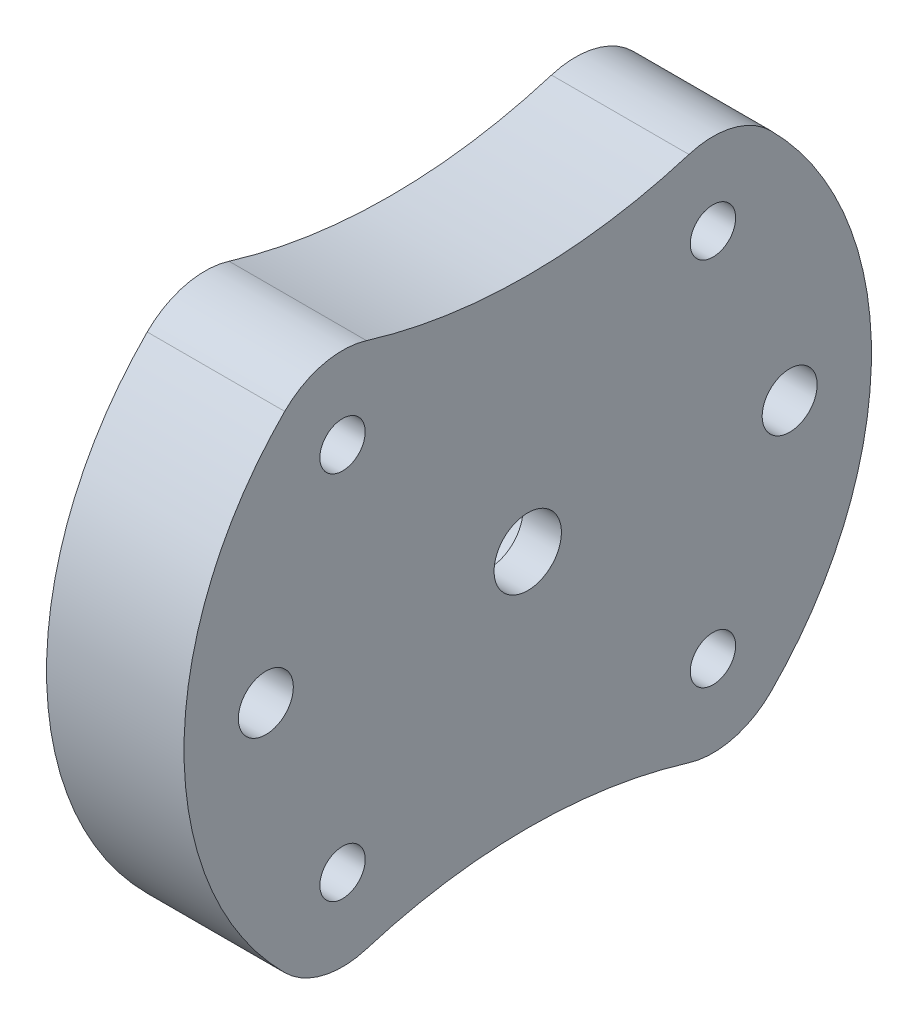
ISO-10303-21;
HEADER;
FILE_DESCRIPTION(('STEP AP214'),'2;1');
FILE_NAME('part.step','',(''),(''),'','','');
FILE_SCHEMA(('AUTOMOTIVE_DESIGN { 1 0 10303 214 1 1 1 1 }'));
ENDSEC;
DATA;
#1=APPLICATION_CONTEXT('core data for automotive mechanical design processes');
#2=APPLICATION_PROTOCOL_DEFINITION('international standard','automotive_design',2000,#1);
#3=PRODUCT_CONTEXT('',#1,'mechanical');
#4=PRODUCT('Part','Part','',(#3));
#5=PRODUCT_RELATED_PRODUCT_CATEGORY('part','',(#4));
#6=PRODUCT_DEFINITION_FORMATION('','',#4);
#7=PRODUCT_DEFINITION_CONTEXT('part definition',#1,'design');
#8=PRODUCT_DEFINITION('design','',#6,#7);
#9=PRODUCT_DEFINITION_SHAPE('','',#8);
#10=(LENGTH_UNIT() NAMED_UNIT(*) SI_UNIT(.MILLI.,.METRE.));
#11=(NAMED_UNIT(*) PLANE_ANGLE_UNIT() SI_UNIT($,.RADIAN.));
#12=(NAMED_UNIT(*) SI_UNIT($,.STERADIAN.) SOLID_ANGLE_UNIT());
#13=UNCERTAINTY_MEASURE_WITH_UNIT(LENGTH_MEASURE(1.E-05),#10,'distance_accuracy_value','');
#14=(GEOMETRIC_REPRESENTATION_CONTEXT(3) GLOBAL_UNCERTAINTY_ASSIGNED_CONTEXT((#13)) GLOBAL_UNIT_ASSIGNED_CONTEXT((#10,
#11,#12)) REPRESENTATION_CONTEXT('',''));
#15=CARTESIAN_POINT('',(0.,0.,0.));
#16=DIRECTION('',(0.,0.,1.));
#17=DIRECTION('',(1.,0.,0.));
#18=AXIS2_PLACEMENT_3D('',#15,#16,#17);
#19=CARTESIAN_POINT('',(10.,0.,0.));
#20=DIRECTION('',(-1.,0.,0.));
#21=DIRECTION('',(0.,0.,1.));
#22=AXIS2_PLACEMENT_3D('',#19,#20,#21);
#23=CYLINDRICAL_SURFACE('',#22,25.);
#24=DIRECTION('',(1.,0.,0.));
#25=VECTOR('',#24,1.);
#26=CARTESIAN_POINT('',(0.,17.6776695296637,17.6776695296637));
#27=LINE('',#26,#25);
#28=CARTESIAN_POINT('',(0.,17.6776695296637,17.6776695296637));
#29=VERTEX_POINT('',#28);
#30=CARTESIAN_POINT('',(10.,17.6776695296637,17.6776695296637));
#31=VERTEX_POINT('',#30);
#32=EDGE_CURVE('E105',#29,#31,#27,.T.);
#33=ORIENTED_EDGE('',*,*,#32,.F.);
#34=CARTESIAN_POINT('',(0.,0.,0.));
#35=DIRECTION('',(1.,0.,0.));
#36=DIRECTION('',(0.,0.,-1.));
#37=AXIS2_PLACEMENT_3D('',#34,#35,#36);
#38=CIRCLE('',#37,25.);
#39=CARTESIAN_POINT('',(0.,-17.6776695296637,17.6776695296637));
#40=VERTEX_POINT('',#39);
#41=EDGE_CURVE('E115',#29,#40,#38,.T.);
#42=ORIENTED_EDGE('',*,*,#41,.T.);
#43=DIRECTION('',(1.,0.,0.));
#44=VECTOR('',#43,1.);
#45=CARTESIAN_POINT('',(0.,-17.6776695296637,17.6776695296637));
#46=LINE('',#45,#44);
#47=CARTESIAN_POINT('',(10.,-17.6776695296637,17.6776695296637));
#48=VERTEX_POINT('',#47);
#49=EDGE_CURVE('E59',#40,#48,#46,.T.);
#50=ORIENTED_EDGE('',*,*,#49,.T.);
#51=CARTESIAN_POINT('',(10.,0.,0.));
#52=DIRECTION('',(1.,0.,0.));
#53=DIRECTION('',(0.,0.,-1.));
#54=AXIS2_PLACEMENT_3D('',#51,#52,#53);
#55=CIRCLE('',#54,25.);
#56=EDGE_CURVE('E11',#31,#48,#55,.T.);
#57=ORIENTED_EDGE('',*,*,#56,.F.);
#58=EDGE_LOOP('',(#33,#42,#50,#57));
#59=FACE_BOUND('',#58,.T.);
#60=ADVANCED_FACE('F35',(#59),#23,.T.);
#61=CARTESIAN_POINT('',(0.,-17.6776695296637,-17.6776695296637));
#62=VERTEX_POINT('',#61);
#63=CARTESIAN_POINT('',(0.,17.6776695296637,-17.6776695296637));
#64=VERTEX_POINT('',#63);
#65=EDGE_CURVE('E122',#62,#64,#38,.T.);
#66=ORIENTED_EDGE('',*,*,#65,.T.);
#67=DIRECTION('',(1.,0.,0.));
#68=VECTOR('',#67,1.);
#69=CARTESIAN_POINT('',(0.,17.6776695296637,-17.6776695296637));
#70=LINE('',#69,#68);
#71=CARTESIAN_POINT('',(10.,17.6776695296637,-17.6776695296637));
#72=VERTEX_POINT('',#71);
#73=EDGE_CURVE('E158',#64,#72,#70,.T.);
#74=ORIENTED_EDGE('',*,*,#73,.T.);
#75=CARTESIAN_POINT('',(10.,-17.6776695296637,-17.6776695296637));
#76=VERTEX_POINT('',#75);
#77=EDGE_CURVE('E43',#76,#72,#55,.T.);
#78=ORIENTED_EDGE('',*,*,#77,.F.);
#79=DIRECTION('',(1.,0.,0.));
#80=VECTOR('',#79,1.);
#81=CARTESIAN_POINT('',(0.,-17.6776695296637,-17.6776695296637));
#82=LINE('',#81,#80);
#83=EDGE_CURVE('E176',#62,#76,#82,.T.);
#84=ORIENTED_EDGE('',*,*,#83,.F.);
#85=EDGE_LOOP('',(#66,#74,#78,#84));
#86=FACE_BOUND('',#85,.T.);
#87=ADVANCED_FACE('F212',(#86),#23,.T.);
#88=CARTESIAN_POINT('',(10.,0.,0.));
#89=DIRECTION('',(1.,0.,0.));
#90=DIRECTION('',(0.,0.,-1.));
#91=AXIS2_PLACEMENT_3D('',#88,#89,#90);
#92=PLANE('',#91);
#93=CARTESIAN_POINT('',(10.,13.4703841816037,13.4703841816037));
#94=DIRECTION('',(1.,0.,0.));
#95=DIRECTION('',(0.,0.,-1.));
#96=AXIS2_PLACEMENT_3D('',#93,#94,#95);
#97=CIRCLE('',#96,1.65000000000009);
#98=CARTESIAN_POINT('',(10.,13.4703841816037,11.8203841816036));
#99=VERTEX_POINT('',#98);
#100=EDGE_CURVE('E154',#99,#99,#97,.T.);
#101=ORIENTED_EDGE('',*,*,#100,.F.);
#102=EDGE_LOOP('',(#101));
#103=FACE_BOUND('',#102,.T.);
#104=CARTESIAN_POINT('',(10.,-13.4703841816037,13.4703841816037));
#105=DIRECTION('',(1.,0.,0.));
#106=DIRECTION('',(0.,0.,-1.));
#107=AXIS2_PLACEMENT_3D('',#104,#105,#106);
#108=CIRCLE('',#107,1.65000000000006);
#109=CARTESIAN_POINT('',(10.,-13.4703841816037,11.8203841816037));
#110=VERTEX_POINT('',#109);
#111=EDGE_CURVE('E161',#110,#110,#108,.T.);
#112=ORIENTED_EDGE('',*,*,#111,.F.);
#113=EDGE_LOOP('',(#112));
#114=FACE_BOUND('',#113,.T.);
#115=CARTESIAN_POINT('',(10.,-13.4703841816037,-13.4703841816037));
#116=DIRECTION('',(1.,0.,0.));
#117=DIRECTION('',(0.,0.,-1.));
#118=AXIS2_PLACEMENT_3D('',#115,#116,#117);
#119=CIRCLE('',#118,1.65000000000003);
#120=CARTESIAN_POINT('',(10.,-13.4703841816037,-15.1203841816038));
#121=VERTEX_POINT('',#120);
#122=EDGE_CURVE('E167',#121,#121,#119,.T.);
#123=ORIENTED_EDGE('',*,*,#122,.F.);
#124=EDGE_LOOP('',(#123));
#125=FACE_BOUND('',#124,.T.);
#126=CARTESIAN_POINT('',(10.,13.4703841816037,-13.4703841816037));
#127=DIRECTION('',(1.,0.,0.));
#128=DIRECTION('',(0.,0.,-1.));
#129=AXIS2_PLACEMENT_3D('',#126,#127,#128);
#130=CIRCLE('',#129,1.65);
#131=CARTESIAN_POINT('',(10.,13.4703841816037,-15.1203841816037));
#132=VERTEX_POINT('',#131);
#133=EDGE_CURVE('E148',#132,#132,#130,.T.);
#134=ORIENTED_EDGE('',*,*,#133,.F.);
#135=EDGE_LOOP('',(#134));
#136=FACE_BOUND('',#135,.T.);
#137=CARTESIAN_POINT('',(10.,0.,19.05));
#138=DIRECTION('',(1.,0.,0.));
#139=DIRECTION('',(0.,0.,-1.));
#140=AXIS2_PLACEMENT_3D('',#137,#138,#139);
#141=CIRCLE('',#140,2.);
#142=CARTESIAN_POINT('',(10.,0.,17.05));
#143=VERTEX_POINT('',#142);
#144=EDGE_CURVE('E143',#143,#143,#141,.T.);
#145=ORIENTED_EDGE('',*,*,#144,.F.);
#146=EDGE_LOOP('',(#145));
#147=FACE_BOUND('',#146,.T.);
#148=CARTESIAN_POINT('',(10.,0.,-19.05));
#149=DIRECTION('',(1.,0.,0.));
#150=DIRECTION('',(0.,0.,1.));
#151=AXIS2_PLACEMENT_3D('',#148,#149,#150);
#152=CIRCLE('',#151,2.);
#153=CARTESIAN_POINT('',(10.,0.,-17.05));
#154=VERTEX_POINT('',#153);
#155=EDGE_CURVE('E136',#154,#154,#152,.T.);
#156=ORIENTED_EDGE('',*,*,#155,.F.);
#157=EDGE_LOOP('',(#156));
#158=FACE_BOUND('',#157,.T.);
#159=CARTESIAN_POINT('',(10.,0.,0.));
#160=DIRECTION('',(1.,0.,0.));
#161=DIRECTION('',(0.,0.,-1.));
#162=AXIS2_PLACEMENT_3D('',#159,#160,#161);
#163=CIRCLE('',#162,2.45);
#164=CARTESIAN_POINT('',(10.,0.,-2.45));
#165=VERTEX_POINT('',#164);
#166=EDGE_CURVE('E125',#165,#165,#163,.T.);
#167=ORIENTED_EDGE('',*,*,#166,.F.);
#168=EDGE_LOOP('',(#167));
#169=FACE_BOUND('',#168,.T.);
#170=ORIENTED_EDGE('',*,*,#77,.T.);
#171=CARTESIAN_POINT('',(10.,13.4703841816037,-13.4703841816037));
#172=DIRECTION('',(1.,0.,0.));
#173=DIRECTION('',(0.,0.,-1.));
#174=AXIS2_PLACEMENT_3D('',#171,#172,#173);
#175=CIRCLE('',#174,5.95);
#176=CARTESIAN_POINT('',(10.,19.1589739981217,-11.7261233354548));
#177=VERTEX_POINT('',#176);
#178=EDGE_CURVE('E110',#72,#177,#175,.T.);
#179=ORIENTED_EDGE('',*,*,#178,.T.);
#180=CARTESIAN_POINT('',(10.,57.4015946133685,0.));
#181=DIRECTION('',(1.,0.,0.));
#182=DIRECTION('',(0.,0.,-1.));
#183=AXIS2_PLACEMENT_3D('',#180,#181,#182);
#184=CIRCLE('',#183,40.);
#185=CARTESIAN_POINT('',(10.,19.1589739981217,11.7261233354548));
#186=VERTEX_POINT('',#185);
#187=EDGE_CURVE('E202',#186,#177,#184,.T.);
#188=ORIENTED_EDGE('',*,*,#187,.F.);
#189=CARTESIAN_POINT('',(10.,13.4703841816037,13.4703841816037));
#190=DIRECTION('',(1.,0.,0.));
#191=DIRECTION('',(0.,0.,-1.));
#192=AXIS2_PLACEMENT_3D('',#189,#190,#191);
#193=CIRCLE('',#192,5.95);
#194=EDGE_CURVE('E181',#186,#31,#193,.T.);
#195=ORIENTED_EDGE('',*,*,#194,.T.);
#196=ORIENTED_EDGE('',*,*,#56,.T.);
#197=CARTESIAN_POINT('',(10.,-13.4703841816037,13.4703841816037));
#198=DIRECTION('',(1.,0.,0.));
#199=DIRECTION('',(0.,0.,-1.));
#200=AXIS2_PLACEMENT_3D('',#197,#198,#199);
#201=CIRCLE('',#200,5.95);
#202=CARTESIAN_POINT('',(10.,-19.1589739981217,11.7261233354548));
#203=VERTEX_POINT('',#202);
#204=EDGE_CURVE('E186',#48,#203,#201,.T.);
#205=ORIENTED_EDGE('',*,*,#204,.T.);
#206=CARTESIAN_POINT('',(10.,-57.4015946133685,0.));
#207=DIRECTION('',(1.,0.,0.));
#208=DIRECTION('',(0.,0.,-1.));
#209=AXIS2_PLACEMENT_3D('',#206,#207,#208);
#210=CIRCLE('',#209,40.);
#211=CARTESIAN_POINT('',(10.,-19.1589739981217,-11.7261233354548));
#212=VERTEX_POINT('',#211);
#213=EDGE_CURVE('E189',#203,#212,#210,.F.);
#214=ORIENTED_EDGE('',*,*,#213,.T.);
#215=CARTESIAN_POINT('',(10.,-13.4703841816037,-13.4703841816037));
#216=DIRECTION('',(1.,0.,0.));
#217=DIRECTION('',(0.,0.,-1.));
#218=AXIS2_PLACEMENT_3D('',#215,#216,#217);
#219=CIRCLE('',#218,5.95000000000001);
#220=EDGE_CURVE('E182',#212,#76,#219,.T.);
#221=ORIENTED_EDGE('',*,*,#220,.T.);
#222=EDGE_LOOP('',(#170,#179,#188,#195,#196,#205,#214,#221));
#223=FACE_BOUND('',#222,.T.);
#224=ADVANCED_FACE('F218',(#103,#114,#125,#136,#147,#158,#169,#223),#92,.T.);
#225=CARTESIAN_POINT('',(0.,0.,0.));
#226=DIRECTION('',(1.,0.,0.));
#227=DIRECTION('',(0.,0.,-1.));
#228=AXIS2_PLACEMENT_3D('',#225,#226,#227);
#229=PLANE('',#228);
#230=CARTESIAN_POINT('',(0.,13.4703841816037,13.4703841816037));
#231=DIRECTION('',(1.,0.,0.));
#232=DIRECTION('',(0.,0.,-1.));
#233=AXIS2_PLACEMENT_3D('',#230,#231,#232);
#234=CIRCLE('',#233,1.65000000000009);
#235=CARTESIAN_POINT('',(0.,13.4703841816037,11.8203841816036));
#236=VERTEX_POINT('',#235);
#237=EDGE_CURVE('E157',#236,#236,#234,.T.);
#238=ORIENTED_EDGE('',*,*,#237,.T.);
#239=EDGE_LOOP('',(#238));
#240=FACE_BOUND('',#239,.T.);
#241=CARTESIAN_POINT('',(0.,-13.4703841816037,13.4703841816037));
#242=DIRECTION('',(1.,0.,0.));
#243=DIRECTION('',(0.,0.,-1.));
#244=AXIS2_PLACEMENT_3D('',#241,#242,#243);
#245=CIRCLE('',#244,1.65000000000006);
#246=CARTESIAN_POINT('',(0.,-13.4703841816037,11.8203841816037));
#247=VERTEX_POINT('',#246);
#248=EDGE_CURVE('E164',#247,#247,#245,.T.);
#249=ORIENTED_EDGE('',*,*,#248,.T.);
#250=EDGE_LOOP('',(#249));
#251=FACE_BOUND('',#250,.T.);
#252=CARTESIAN_POINT('',(0.,-13.4703841816037,-13.4703841816037));
#253=DIRECTION('',(1.,0.,0.));
#254=DIRECTION('',(0.,0.,-1.));
#255=AXIS2_PLACEMENT_3D('',#252,#253,#254);
#256=CIRCLE('',#255,1.65000000000003);
#257=CARTESIAN_POINT('',(0.,-13.4703841816037,-15.1203841816038));
#258=VERTEX_POINT('',#257);
#259=EDGE_CURVE('E151',#258,#258,#256,.T.);
#260=ORIENTED_EDGE('',*,*,#259,.T.);
#261=EDGE_LOOP('',(#260));
#262=FACE_BOUND('',#261,.T.);
#263=CARTESIAN_POINT('',(0.,13.4703841816037,-13.4703841816037));
#264=DIRECTION('',(1.,0.,0.));
#265=DIRECTION('',(0.,0.,-1.));
#266=AXIS2_PLACEMENT_3D('',#263,#264,#265);
#267=CIRCLE('',#266,1.65);
#268=CARTESIAN_POINT('',(0.,13.4703841816037,-15.1203841816037));
#269=VERTEX_POINT('',#268);
#270=EDGE_CURVE('E140',#269,#269,#267,.T.);
#271=ORIENTED_EDGE('',*,*,#270,.T.);
#272=EDGE_LOOP('',(#271));
#273=FACE_BOUND('',#272,.T.);
#274=CARTESIAN_POINT('',(0.,0.,19.05));
#275=DIRECTION('',(1.,0.,0.));
#276=DIRECTION('',(0.,0.,-1.));
#277=AXIS2_PLACEMENT_3D('',#274,#275,#276);
#278=CIRCLE('',#277,2.);
#279=CARTESIAN_POINT('',(0.,0.,17.05));
#280=VERTEX_POINT('',#279);
#281=EDGE_CURVE('E133',#280,#280,#278,.T.);
#282=ORIENTED_EDGE('',*,*,#281,.T.);
#283=EDGE_LOOP('',(#282));
#284=FACE_BOUND('',#283,.T.);
#285=CARTESIAN_POINT('',(0.,0.,-19.05));
#286=DIRECTION('',(1.,0.,0.));
#287=DIRECTION('',(0.,0.,1.));
#288=AXIS2_PLACEMENT_3D('',#285,#286,#287);
#289=CIRCLE('',#288,2.);
#290=CARTESIAN_POINT('',(0.,0.,-17.05));
#291=VERTEX_POINT('',#290);
#292=EDGE_CURVE('E139',#291,#291,#289,.T.);
#293=ORIENTED_EDGE('',*,*,#292,.T.);
#294=EDGE_LOOP('',(#293));
#295=FACE_BOUND('',#294,.T.);
#296=CARTESIAN_POINT('',(0.,0.,0.));
#297=DIRECTION('',(-1.,0.,0.));
#298=DIRECTION('',(0.,0.,1.));
#299=AXIS2_PLACEMENT_3D('',#296,#297,#298);
#300=CIRCLE('',#299,4.95);
#301=CARTESIAN_POINT('',(0.,0.,4.95));
#302=VERTEX_POINT('',#301);
#303=EDGE_CURVE('E129',#302,#302,#300,.T.);
#304=ORIENTED_EDGE('',*,*,#303,.F.);
#305=EDGE_LOOP('',(#304));
#306=FACE_BOUND('',#305,.T.);
#307=CARTESIAN_POINT('',(0.,13.4703841816037,-13.4703841816037));
#308=DIRECTION('',(1.,0.,0.));
#309=DIRECTION('',(0.,0.,-1.));
#310=AXIS2_PLACEMENT_3D('',#307,#308,#309);
#311=CIRCLE('',#310,5.95);
#312=CARTESIAN_POINT('',(0.,19.1589739981217,-11.7261233354548));
#313=VERTEX_POINT('',#312);
#314=EDGE_CURVE('E116',#64,#313,#311,.T.);
#315=ORIENTED_EDGE('',*,*,#314,.F.);
#316=ORIENTED_EDGE('',*,*,#65,.F.);
#317=CARTESIAN_POINT('',(0.,-13.4703841816037,-13.4703841816037));
#318=DIRECTION('',(1.,0.,0.));
#319=DIRECTION('',(0.,0.,-1.));
#320=AXIS2_PLACEMENT_3D('',#317,#318,#319);
#321=CIRCLE('',#320,5.95000000000001);
#322=CARTESIAN_POINT('',(0.,-19.1589739981217,-11.7261233354548));
#323=VERTEX_POINT('',#322);
#324=EDGE_CURVE('E174',#323,#62,#321,.T.);
#325=ORIENTED_EDGE('',*,*,#324,.F.);
#326=CARTESIAN_POINT('',(0.,-57.4015946133685,0.));
#327=DIRECTION('',(1.,0.,0.));
#328=DIRECTION('',(0.,0.,-1.));
#329=AXIS2_PLACEMENT_3D('',#326,#327,#328);
#330=CIRCLE('',#329,40.);
#331=CARTESIAN_POINT('',(0.,-19.1589739981217,11.7261233354548));
#332=VERTEX_POINT('',#331);
#333=EDGE_CURVE('E185',#332,#323,#330,.F.);
#334=ORIENTED_EDGE('',*,*,#333,.F.);
#335=CARTESIAN_POINT('',(0.,-13.4703841816037,13.4703841816037));
#336=DIRECTION('',(1.,0.,0.));
#337=DIRECTION('',(0.,0.,-1.));
#338=AXIS2_PLACEMENT_3D('',#335,#336,#337);
#339=CIRCLE('',#338,5.95);
#340=EDGE_CURVE('E121',#40,#332,#339,.T.);
#341=ORIENTED_EDGE('',*,*,#340,.F.);
#342=ORIENTED_EDGE('',*,*,#41,.F.);
#343=CARTESIAN_POINT('',(0.,13.4703841816037,13.4703841816037));
#344=DIRECTION('',(1.,0.,0.));
#345=DIRECTION('',(0.,0.,-1.));
#346=AXIS2_PLACEMENT_3D('',#343,#344,#345);
#347=CIRCLE('',#346,5.95);
#348=CARTESIAN_POINT('',(0.,19.1589739981217,11.7261233354548));
#349=VERTEX_POINT('',#348);
#350=EDGE_CURVE('E101',#349,#29,#347,.T.);
#351=ORIENTED_EDGE('',*,*,#350,.F.);
#352=CARTESIAN_POINT('',(0.,57.4015946133685,0.));
#353=DIRECTION('',(1.,0.,0.));
#354=DIRECTION('',(0.,0.,-1.));
#355=AXIS2_PLACEMENT_3D('',#352,#353,#354);
#356=CIRCLE('',#355,40.);
#357=EDGE_CURVE('E51',#349,#313,#356,.T.);
#358=ORIENTED_EDGE('',*,*,#357,.T.);
#359=EDGE_LOOP('',(#315,#316,#325,#334,#341,#342,#351,#358));
#360=FACE_BOUND('',#359,.T.);
#361=ADVANCED_FACE('F119',(#240,#251,#262,#273,#284,#295,#306,#360),#229,.F.);
#362=CARTESIAN_POINT('',(0.,0.,0.));
#363=DIRECTION('',(1.,0.,0.));
#364=DIRECTION('',(0.,0.,-1.));
#365=AXIS2_PLACEMENT_3D('',#362,#363,#364);
#366=CYLINDRICAL_SURFACE('',#365,2.45);
#367=ORIENTED_EDGE('',*,*,#166,.T.);
#368=EDGE_LOOP('',(#367));
#369=FACE_BOUND('',#368,.T.);
#370=CARTESIAN_POINT('',(7.2,0.,0.));
#371=DIRECTION('',(-1.,0.,0.));
#372=DIRECTION('',(0.,0.,1.));
#373=AXIS2_PLACEMENT_3D('',#370,#371,#372);
#374=CIRCLE('',#373,2.45);
#375=CARTESIAN_POINT('',(7.2,0.,2.45));
#376=VERTEX_POINT('',#375);
#377=EDGE_CURVE('E38',#376,#376,#374,.F.);
#378=ORIENTED_EDGE('',*,*,#377,.F.);
#379=EDGE_LOOP('',(#378));
#380=FACE_BOUND('',#379,.T.);
#381=ADVANCED_FACE('F247',(#369,#380),#366,.F.);
#382=CARTESIAN_POINT('',(7.2,0.,0.));
#383=DIRECTION('',(-1.,0.,0.));
#384=DIRECTION('',(0.,0.,1.));
#385=AXIS2_PLACEMENT_3D('',#382,#383,#384);
#386=PLANE('',#385);
#387=CARTESIAN_POINT('',(7.2,0.,0.));
#388=DIRECTION('',(-1.,0.,0.));
#389=DIRECTION('',(0.,0.,1.));
#390=AXIS2_PLACEMENT_3D('',#387,#388,#389);
#391=CIRCLE('',#390,4.95);
#392=CARTESIAN_POINT('',(7.2,0.,4.95));
#393=VERTEX_POINT('',#392);
#394=EDGE_CURVE('E132',#393,#393,#391,.T.);
#395=ORIENTED_EDGE('',*,*,#394,.T.);
#396=EDGE_LOOP('',(#395));
#397=FACE_BOUND('',#396,.T.);
#398=ORIENTED_EDGE('',*,*,#377,.T.);
#399=EDGE_LOOP('',(#398));
#400=FACE_BOUND('',#399,.T.);
#401=ADVANCED_FACE('F254',(#397,#400),#386,.T.);
#402=CARTESIAN_POINT('',(7.2,0.,0.));
#403=DIRECTION('',(-1.,0.,0.));
#404=DIRECTION('',(0.,0.,1.));
#405=AXIS2_PLACEMENT_3D('',#402,#403,#404);
#406=CYLINDRICAL_SURFACE('',#405,4.95);
#407=ORIENTED_EDGE('',*,*,#394,.F.);
#408=EDGE_LOOP('',(#407));
#409=FACE_BOUND('',#408,.T.);
#410=ORIENTED_EDGE('',*,*,#303,.T.);
#411=EDGE_LOOP('',(#410));
#412=FACE_BOUND('',#411,.T.);
#413=ADVANCED_FACE('F256',(#409,#412),#406,.F.);
#414=CARTESIAN_POINT('',(0.,0.,-19.05));
#415=DIRECTION('',(1.,0.,0.));
#416=DIRECTION('',(0.,0.,-1.));
#417=AXIS2_PLACEMENT_3D('',#414,#415,#416);
#418=CYLINDRICAL_SURFACE('',#417,2.);
#419=ORIENTED_EDGE('',*,*,#292,.F.);
#420=EDGE_LOOP('',(#419));
#421=FACE_BOUND('',#420,.T.);
#422=ORIENTED_EDGE('',*,*,#155,.T.);
#423=EDGE_LOOP('',(#422));
#424=FACE_BOUND('',#423,.T.);
#425=ADVANCED_FACE('F259',(#421,#424),#418,.F.);
#426=CARTESIAN_POINT('',(0.,0.,19.05));
#427=DIRECTION('',(1.,0.,0.));
#428=DIRECTION('',(0.,0.,-1.));
#429=AXIS2_PLACEMENT_3D('',#426,#427,#428);
#430=CYLINDRICAL_SURFACE('',#429,2.);
#431=ORIENTED_EDGE('',*,*,#281,.F.);
#432=EDGE_LOOP('',(#431));
#433=FACE_BOUND('',#432,.T.);
#434=ORIENTED_EDGE('',*,*,#144,.T.);
#435=EDGE_LOOP('',(#434));
#436=FACE_BOUND('',#435,.T.);
#437=ADVANCED_FACE('F266',(#433,#436),#430,.F.);
#438=CARTESIAN_POINT('',(0.,13.4703841816037,-13.4703841816037));
#439=DIRECTION('',(1.,0.,0.));
#440=DIRECTION('',(0.,0.,-1.));
#441=AXIS2_PLACEMENT_3D('',#438,#439,#440);
#442=CYLINDRICAL_SURFACE('',#441,1.65);
#443=ORIENTED_EDGE('',*,*,#270,.F.);
#444=EDGE_LOOP('',(#443));
#445=FACE_BOUND('',#444,.T.);
#446=ORIENTED_EDGE('',*,*,#133,.T.);
#447=EDGE_LOOP('',(#446));
#448=FACE_BOUND('',#447,.T.);
#449=ADVANCED_FACE('F270',(#445,#448),#442,.F.);
#450=CARTESIAN_POINT('',(0.,-13.4703841816037,-13.4703841816037));
#451=DIRECTION('',(1.,0.,0.));
#452=DIRECTION('',(0.,0.,-1.));
#453=AXIS2_PLACEMENT_3D('',#450,#451,#452);
#454=CYLINDRICAL_SURFACE('',#453,1.65000000000003);
#455=ORIENTED_EDGE('',*,*,#259,.F.);
#456=EDGE_LOOP('',(#455));
#457=FACE_BOUND('',#456,.T.);
#458=ORIENTED_EDGE('',*,*,#122,.T.);
#459=EDGE_LOOP('',(#458));
#460=FACE_BOUND('',#459,.T.);
#461=ADVANCED_FACE('F274',(#457,#460),#454,.F.);
#462=CARTESIAN_POINT('',(0.,-13.4703841816037,13.4703841816037));
#463=DIRECTION('',(1.,0.,0.));
#464=DIRECTION('',(0.,0.,-1.));
#465=AXIS2_PLACEMENT_3D('',#462,#463,#464);
#466=CYLINDRICAL_SURFACE('',#465,1.65000000000006);
#467=ORIENTED_EDGE('',*,*,#248,.F.);
#468=EDGE_LOOP('',(#467));
#469=FACE_BOUND('',#468,.T.);
#470=ORIENTED_EDGE('',*,*,#111,.T.);
#471=EDGE_LOOP('',(#470));
#472=FACE_BOUND('',#471,.T.);
#473=ADVANCED_FACE('F279',(#469,#472),#466,.F.);
#474=CARTESIAN_POINT('',(0.,13.4703841816037,13.4703841816037));
#475=DIRECTION('',(1.,0.,0.));
#476=DIRECTION('',(0.,0.,-1.));
#477=AXIS2_PLACEMENT_3D('',#474,#475,#476);
#478=CYLINDRICAL_SURFACE('',#477,1.65000000000009);
#479=ORIENTED_EDGE('',*,*,#237,.F.);
#480=EDGE_LOOP('',(#479));
#481=FACE_BOUND('',#480,.T.);
#482=ORIENTED_EDGE('',*,*,#100,.T.);
#483=EDGE_LOOP('',(#482));
#484=FACE_BOUND('',#483,.T.);
#485=ADVANCED_FACE('F276',(#481,#484),#478,.F.);
#486=CARTESIAN_POINT('',(0.,-57.4015946133685,0.));
#487=DIRECTION('',(1.,0.,0.));
#488=DIRECTION('',(0.,0.,-1.));
#489=AXIS2_PLACEMENT_3D('',#486,#487,#488);
#490=CYLINDRICAL_SURFACE('',#489,40.);
#491=ORIENTED_EDGE('',*,*,#213,.F.);
#492=DIRECTION('',(1.,0.,0.));
#493=VECTOR('',#492,1.);
#494=CARTESIAN_POINT('',(0.,-19.1589739981217,11.7261233354548));
#495=LINE('',#494,#493);
#496=EDGE_CURVE('E172',#332,#203,#495,.T.);
#497=ORIENTED_EDGE('',*,*,#496,.F.);
#498=ORIENTED_EDGE('',*,*,#333,.T.);
#499=DIRECTION('',(1.,0.,0.));
#500=VECTOR('',#499,1.);
#501=CARTESIAN_POINT('',(0.,-19.1589739981217,-11.7261233354548));
#502=LINE('',#501,#500);
#503=EDGE_CURVE('E178',#323,#212,#502,.T.);
#504=ORIENTED_EDGE('',*,*,#503,.T.);
#505=EDGE_LOOP('',(#491,#497,#498,#504));
#506=FACE_BOUND('',#505,.T.);
#507=ADVANCED_FACE('F222',(#506),#490,.F.);
#508=CARTESIAN_POINT('',(0.,-13.4703841816037,-13.4703841816037));
#509=DIRECTION('',(1.,0.,0.));
#510=DIRECTION('',(0.,0.,-1.));
#511=AXIS2_PLACEMENT_3D('',#508,#509,#510);
#512=CYLINDRICAL_SURFACE('',#511,5.95000000000001);
#513=ORIENTED_EDGE('',*,*,#220,.F.);
#514=ORIENTED_EDGE('',*,*,#503,.F.);
#515=ORIENTED_EDGE('',*,*,#324,.T.);
#516=ORIENTED_EDGE('',*,*,#83,.T.);
#517=EDGE_LOOP('',(#513,#514,#515,#516));
#518=FACE_BOUND('',#517,.T.);
#519=ADVANCED_FACE('F215',(#518),#512,.T.);
#520=CARTESIAN_POINT('',(0.,-13.4703841816037,13.4703841816037));
#521=DIRECTION('',(1.,0.,0.));
#522=DIRECTION('',(0.,0.,-1.));
#523=AXIS2_PLACEMENT_3D('',#520,#521,#522);
#524=CYLINDRICAL_SURFACE('',#523,5.95);
#525=ORIENTED_EDGE('',*,*,#204,.F.);
#526=ORIENTED_EDGE('',*,*,#49,.F.);
#527=ORIENTED_EDGE('',*,*,#340,.T.);
#528=ORIENTED_EDGE('',*,*,#496,.T.);
#529=EDGE_LOOP('',(#525,#526,#527,#528));
#530=FACE_BOUND('',#529,.T.);
#531=ADVANCED_FACE('F223',(#530),#524,.T.);
#532=CARTESIAN_POINT('',(0.,13.4703841816037,-13.4703841816037));
#533=DIRECTION('',(1.,0.,0.));
#534=DIRECTION('',(0.,0.,-1.));
#535=AXIS2_PLACEMENT_3D('',#532,#533,#534);
#536=CYLINDRICAL_SURFACE('',#535,5.95);
#537=ORIENTED_EDGE('',*,*,#178,.F.);
#538=ORIENTED_EDGE('',*,*,#73,.F.);
#539=ORIENTED_EDGE('',*,*,#314,.T.);
#540=DIRECTION('',(1.,0.,0.));
#541=VECTOR('',#540,1.);
#542=CARTESIAN_POINT('',(0.,19.1589739981217,-11.7261233354548));
#543=LINE('',#542,#541);
#544=EDGE_CURVE('E196',#313,#177,#543,.T.);
#545=ORIENTED_EDGE('',*,*,#544,.T.);
#546=EDGE_LOOP('',(#537,#538,#539,#545));
#547=FACE_BOUND('',#546,.T.);
#548=ADVANCED_FACE('F226',(#547),#536,.T.);
#549=CARTESIAN_POINT('',(0.,57.4015946133685,0.));
#550=DIRECTION('',(1.,0.,0.));
#551=DIRECTION('',(0.,0.,-1.));
#552=AXIS2_PLACEMENT_3D('',#549,#550,#551);
#553=CYLINDRICAL_SURFACE('',#552,40.);
#554=ORIENTED_EDGE('',*,*,#187,.T.);
#555=ORIENTED_EDGE('',*,*,#544,.F.);
#556=ORIENTED_EDGE('',*,*,#357,.F.);
#557=DIRECTION('',(1.,0.,0.));
#558=VECTOR('',#557,1.);
#559=CARTESIAN_POINT('',(0.,19.1589739981217,11.7261233354548));
#560=LINE('',#559,#558);
#561=EDGE_CURVE('E107',#349,#186,#560,.T.);
#562=ORIENTED_EDGE('',*,*,#561,.T.);
#563=EDGE_LOOP('',(#554,#555,#556,#562));
#564=FACE_BOUND('',#563,.T.);
#565=ADVANCED_FACE('F225',(#564),#553,.F.);
#566=CARTESIAN_POINT('',(0.,13.4703841816037,13.4703841816037));
#567=DIRECTION('',(1.,0.,0.));
#568=DIRECTION('',(0.,0.,-1.));
#569=AXIS2_PLACEMENT_3D('',#566,#567,#568);
#570=CYLINDRICAL_SURFACE('',#569,5.95);
#571=ORIENTED_EDGE('',*,*,#194,.F.);
#572=ORIENTED_EDGE('',*,*,#561,.F.);
#573=ORIENTED_EDGE('',*,*,#350,.T.);
#574=ORIENTED_EDGE('',*,*,#32,.T.);
#575=EDGE_LOOP('',(#571,#572,#573,#574));
#576=FACE_BOUND('',#575,.T.);
#577=ADVANCED_FACE('F104',(#576),#570,.T.);
#578=CLOSED_SHELL('',(#60,#87,#224,#361,#381,#401,#413,#425,#437,#449,#461,#473,#485,#507,#519,
#531,#548,#565,#577));
#579=MANIFOLD_SOLID_BREP('B2',#578);
#580=ADVANCED_BREP_SHAPE_REPRESENTATION('',(#18,#579),#14);
#581=SHAPE_DEFINITION_REPRESENTATION(#9,#580);
ENDSEC;
END-ISO-10303-21;
